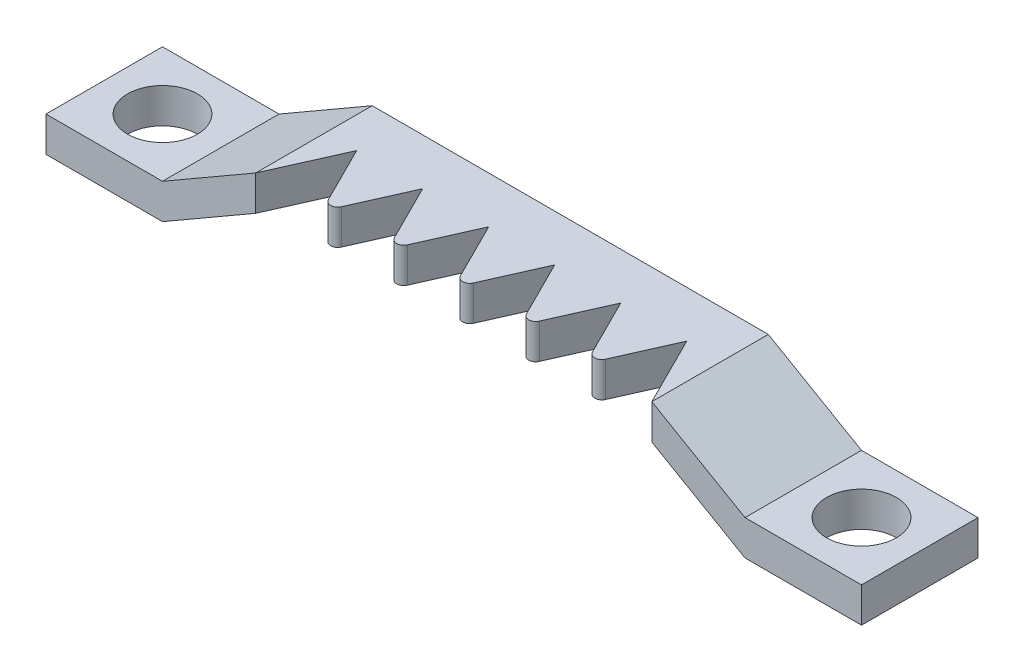
ISO-10303-21;
HEADER;
FILE_DESCRIPTION(('STEP AP214'),'2;1');
FILE_NAME('part.step','',(''),(''),'','','');
FILE_SCHEMA(('AUTOMOTIVE_DESIGN { 1 0 10303 214 1 1 1 1 }'));
ENDSEC;
DATA;
#1=APPLICATION_CONTEXT('core data for automotive mechanical design processes');
#2=APPLICATION_PROTOCOL_DEFINITION('international standard','automotive_design',2000,#1);
#3=PRODUCT_CONTEXT('',#1,'mechanical');
#4=PRODUCT('Part','Part','',(#3));
#5=PRODUCT_RELATED_PRODUCT_CATEGORY('part','',(#4));
#6=PRODUCT_DEFINITION_FORMATION('','',#4);
#7=PRODUCT_DEFINITION_CONTEXT('part definition',#1,'design');
#8=PRODUCT_DEFINITION('design','',#6,#7);
#9=PRODUCT_DEFINITION_SHAPE('','',#8);
#10=(LENGTH_UNIT() NAMED_UNIT(*) SI_UNIT(.MILLI.,.METRE.));
#11=(NAMED_UNIT(*) PLANE_ANGLE_UNIT() SI_UNIT($,.RADIAN.));
#12=(NAMED_UNIT(*) SI_UNIT($,.STERADIAN.) SOLID_ANGLE_UNIT());
#13=UNCERTAINTY_MEASURE_WITH_UNIT(LENGTH_MEASURE(1.E-05),#10,'distance_accuracy_value','');
#14=(GEOMETRIC_REPRESENTATION_CONTEXT(3) GLOBAL_UNCERTAINTY_ASSIGNED_CONTEXT((#13)) GLOBAL_UNIT_ASSIGNED_CONTEXT((#10,
#11,#12)) REPRESENTATION_CONTEXT('',''));
#15=CARTESIAN_POINT('',(0.,0.,0.));
#16=DIRECTION('',(0.,0.,1.));
#17=DIRECTION('',(1.,0.,0.));
#18=AXIS2_PLACEMENT_3D('',#15,#16,#17);
#19=CARTESIAN_POINT('',(0.,0.,6.35));
#20=DIRECTION('',(0.,0.,1.));
#21=DIRECTION('',(1.,0.,0.));
#22=AXIS2_PLACEMENT_3D('',#19,#20,#21);
#23=PLANE('',#22);
#24=DIRECTION('',(0.,1.,0.));
#25=VECTOR('',#24,1.);
#26=CARTESIAN_POINT('',(11.43,-0.00100000000000534,6.35));
#27=LINE('',#26,#25);
#28=CARTESIAN_POINT('',(11.43,2.93293936748331,6.35));
#29=VERTEX_POINT('',#28);
#30=CARTESIAN_POINT('',(11.43,4.83793936748331,6.35));
#31=VERTEX_POINT('',#30);
#32=EDGE_CURVE('E345',#29,#31,#27,.T.);
#33=ORIENTED_EDGE('',*,*,#32,.T.);
#34=DIRECTION('',(-0.866025403784438,-0.500000000000001,0.));
#35=VECTOR('',#34,1.);
#36=CARTESIAN_POINT('',(11.43,4.83793936748331,6.35));
#37=LINE('',#36,#35);
#38=CARTESIAN_POINT('',(6.35,1.905,6.35));
#39=VERTEX_POINT('',#38);
#40=EDGE_CURVE('E384',#31,#39,#37,.T.);
#41=ORIENTED_EDGE('',*,*,#40,.T.);
#42=DIRECTION('',(-1.,0.,0.));
#43=VECTOR('',#42,1.);
#44=CARTESIAN_POINT('',(6.35,1.905,6.35));
#45=LINE('',#44,#43);
#46=CARTESIAN_POINT('',(0.,1.905,6.35));
#47=VERTEX_POINT('',#46);
#48=EDGE_CURVE('E386',#39,#47,#45,.T.);
#49=ORIENTED_EDGE('',*,*,#48,.T.);
#50=DIRECTION('',(0.,-1.,0.));
#51=VECTOR('',#50,1.);
#52=CARTESIAN_POINT('',(0.,1.905,6.35));
#53=LINE('',#52,#51);
#54=CARTESIAN_POINT('',(0.,0.,6.35));
#55=VERTEX_POINT('',#54);
#56=EDGE_CURVE('E364',#47,#55,#53,.T.);
#57=ORIENTED_EDGE('',*,*,#56,.T.);
#58=DIRECTION('',(1.,0.,0.));
#59=VECTOR('',#58,1.);
#60=CARTESIAN_POINT('',(0.,0.,6.35));
#61=LINE('',#60,#59);
#62=CARTESIAN_POINT('',(6.35,0.,6.35));
#63=VERTEX_POINT('',#62);
#64=EDGE_CURVE('E367',#55,#63,#61,.T.);
#65=ORIENTED_EDGE('',*,*,#64,.T.);
#66=DIRECTION('',(0.866025403784438,0.500000000000001,0.));
#67=VECTOR('',#66,1.);
#68=CARTESIAN_POINT('',(6.35,0.,6.35));
#69=LINE('',#68,#67);
#70=EDGE_CURVE('E370',#63,#29,#69,.T.);
#71=ORIENTED_EDGE('',*,*,#70,.T.);
#72=EDGE_LOOP('',(#33,#41,#49,#57,#65,#71));
#73=FACE_BOUND('',#72,.T.);
#74=ADVANCED_FACE('F69',(#73),#23,.T.);
#75=CARTESIAN_POINT('',(0.,1.905,6.35));
#76=DIRECTION('',(1.,0.,0.));
#77=DIRECTION('',(0.,0.,-1.));
#78=AXIS2_PLACEMENT_3D('',#75,#76,#77);
#79=PLANE('',#78);
#80=DIRECTION('',(0.,-1.,0.));
#81=VECTOR('',#80,1.);
#82=CARTESIAN_POINT('',(0.,1.905,0.));
#83=LINE('',#82,#81);
#84=CARTESIAN_POINT('',(0.,1.905,0.));
#85=VERTEX_POINT('',#84);
#86=CARTESIAN_POINT('',(0.,0.,0.));
#87=VERTEX_POINT('',#86);
#88=EDGE_CURVE('E359',#85,#87,#83,.T.);
#89=ORIENTED_EDGE('',*,*,#88,.T.);
#90=DIRECTION('',(0.,0.,-1.));
#91=VECTOR('',#90,1.);
#92=CARTESIAN_POINT('',(0.,0.,6.35));
#93=LINE('',#92,#91);
#94=EDGE_CURVE('E444',#55,#87,#93,.T.);
#95=ORIENTED_EDGE('',*,*,#94,.F.);
#96=ORIENTED_EDGE('',*,*,#56,.F.);
#97=DIRECTION('',(0.,0.,-1.));
#98=VECTOR('',#97,1.);
#99=CARTESIAN_POINT('',(0.,1.905,6.35));
#100=LINE('',#99,#98);
#101=EDGE_CURVE('E388',#47,#85,#100,.T.);
#102=ORIENTED_EDGE('',*,*,#101,.T.);
#103=EDGE_LOOP('',(#89,#95,#96,#102));
#104=FACE_BOUND('',#103,.T.);
#105=ADVANCED_FACE('F535',(#104),#79,.F.);
#106=CARTESIAN_POINT('',(0.,0.,6.35));
#107=DIRECTION('',(0.,1.,0.));
#108=DIRECTION('',(-1.,0.,0.));
#109=AXIS2_PLACEMENT_3D('',#106,#107,#108);
#110=PLANE('',#109);
#111=CARTESIAN_POINT('',(3.175,0.,3.175));
#112=DIRECTION('',(0.,1.,0.));
#113=DIRECTION('',(-1.,0.,0.));
#114=AXIS2_PLACEMENT_3D('',#111,#112,#113);
#115=CIRCLE('',#114,1.905);
#116=CARTESIAN_POINT('',(1.27,0.,3.175));
#117=VERTEX_POINT('',#116);
#118=EDGE_CURVE('E356',#117,#117,#115,.F.);
#119=ORIENTED_EDGE('',*,*,#118,.F.);
#120=EDGE_LOOP('',(#119));
#121=FACE_BOUND('',#120,.T.);
#122=DIRECTION('',(1.,0.,0.));
#123=VECTOR('',#122,1.);
#124=CARTESIAN_POINT('',(0.,0.,0.));
#125=LINE('',#124,#123);
#126=CARTESIAN_POINT('',(6.35,0.,0.));
#127=VERTEX_POINT('',#126);
#128=EDGE_CURVE('E391',#87,#127,#125,.T.);
#129=ORIENTED_EDGE('',*,*,#128,.T.);
#130=DIRECTION('',(0.,0.,-1.));
#131=VECTOR('',#130,1.);
#132=CARTESIAN_POINT('',(6.35,0.,6.35));
#133=LINE('',#132,#131);
#134=EDGE_CURVE('E441',#63,#127,#133,.T.);
#135=ORIENTED_EDGE('',*,*,#134,.F.);
#136=ORIENTED_EDGE('',*,*,#64,.F.);
#137=ORIENTED_EDGE('',*,*,#94,.T.);
#138=EDGE_LOOP('',(#129,#135,#136,#137));
#139=FACE_BOUND('',#138,.T.);
#140=ADVANCED_FACE('F542',(#121,#139),#110,.F.);
#141=CARTESIAN_POINT('',(6.35,0.,6.35));
#142=DIRECTION('',(-0.500000000000001,0.866025403784438,0.));
#143=DIRECTION('',(-0.866025403784438,-0.500000000000001,0.));
#144=AXIS2_PLACEMENT_3D('',#141,#142,#143);
#145=PLANE('',#144);
#146=DIRECTION('',(0.866025403784438,0.500000000000001,0.));
#147=VECTOR('',#146,1.);
#148=CARTESIAN_POINT('',(6.35,0.,0.));
#149=LINE('',#148,#147);
#150=CARTESIAN_POINT('',(11.43,2.93293936748331,0.));
#151=VERTEX_POINT('',#150);
#152=EDGE_CURVE('E393',#127,#151,#149,.T.);
#153=ORIENTED_EDGE('',*,*,#152,.T.);
#154=DIRECTION('',(0.,0.,-1.));
#155=VECTOR('',#154,1.);
#156=CARTESIAN_POINT('',(11.43,2.93293936748331,6.35));
#157=LINE('',#156,#155);
#158=EDGE_CURVE('E438',#29,#151,#157,.T.);
#159=ORIENTED_EDGE('',*,*,#158,.F.);
#160=ORIENTED_EDGE('',*,*,#70,.F.);
#161=ORIENTED_EDGE('',*,*,#134,.T.);
#162=EDGE_LOOP('',(#153,#159,#160,#161));
#163=FACE_BOUND('',#162,.T.);
#164=ADVANCED_FACE('F617',(#163),#145,.F.);
#165=CARTESIAN_POINT('',(11.43,2.93293936748331,6.35));
#166=DIRECTION('',(0.,1.,0.));
#167=DIRECTION('',(0.,0.,1.));
#168=AXIS2_PLACEMENT_3D('',#165,#166,#167);
#169=PLANE('',#168);
#170=DIRECTION('',(0.406138466053445,0.,-0.913811548620258));
#171=VECTOR('',#170,1.);
#172=CARTESIAN_POINT('',(14.9061340206186,2.93293936748331,6.62494845360823));
#173=LINE('',#172,#171);
#174=CARTESIAN_POINT('',(15.3562221671944,2.93293936748331,5.61225012381264));
#175=VERTEX_POINT('',#174);
#176=CARTESIAN_POINT('',(16.7216666666667,2.93293936748331,2.5400000000001));
#177=VERTEX_POINT('',#176);
#178=EDGE_CURVE('E268',#175,#177,#173,.T.);
#179=ORIENTED_EDGE('',*,*,#178,.F.);
#180=CARTESIAN_POINT('',(15.0080599671701,2.93293936748331,5.45751136824628));
#181=DIRECTION('',(0.,1.,0.));
#182=DIRECTION('',(0.,0.,1.));
#183=AXIS2_PLACEMENT_3D('',#180,#181,#182);
#184=CIRCLE('',#183,0.381);
#185=CARTESIAN_POINT('',(14.6672832073991,2.93293936748331,5.62789974813177));
#186=VERTEX_POINT('',#185);
#187=EDGE_CURVE('E468',#175,#186,#184,.F.);
#188=ORIENTED_EDGE('',*,*,#187,.T.);
#189=DIRECTION('',(0.447213595499958,0.,0.894427190999916));
#190=VECTOR('',#189,1.);
#191=CARTESIAN_POINT('',(9.48266666666661,2.93293936748331,-4.7413333333333));
#192=LINE('',#191,#190);
#193=CARTESIAN_POINT('',(13.1233333333333,2.93293936748331,2.54000000000013));
#194=VERTEX_POINT('',#193);
#195=EDGE_CURVE('E330',#194,#186,#192,.T.);
#196=ORIENTED_EDGE('',*,*,#195,.F.);
#197=DIRECTION('',(0.406138466053447,0.,-0.913811548620258));
#198=VECTOR('',#197,1.);
#199=CARTESIAN_POINT('',(11.9013402061856,2.93293936748331,5.28948453608248));
#200=LINE('',#199,#198);
#201=EDGE_CURVE('E300',#29,#194,#200,.T.);
#202=ORIENTED_EDGE('',*,*,#201,.F.);
#203=ORIENTED_EDGE('',*,*,#158,.T.);
#204=DIRECTION('',(1.,0.,0.));
#205=VECTOR('',#204,1.);
#206=CARTESIAN_POINT('',(11.43,2.93293936748331,0.));
#207=LINE('',#206,#205);
#208=CARTESIAN_POINT('',(33.02,2.93293936748331,0.));
#209=VERTEX_POINT('',#208);
#210=EDGE_CURVE('E395',#151,#209,#207,.T.);
#211=ORIENTED_EDGE('',*,*,#210,.T.);
#212=DIRECTION('',(0.,0.,-1.));
#213=VECTOR('',#212,1.);
#214=CARTESIAN_POINT('',(33.02,2.93293936748331,6.35));
#215=LINE('',#214,#213);
#216=CARTESIAN_POINT('',(33.02,2.93293936748331,6.35));
#217=VERTEX_POINT('',#216);
#218=EDGE_CURVE('E435',#217,#209,#215,.T.);
#219=ORIENTED_EDGE('',*,*,#218,.F.);
#220=DIRECTION('',(0.447213595499958,0.,0.894427190999916));
#221=VECTOR('',#220,1.);
#222=CARTESIAN_POINT('',(23.876,2.93293936748331,-11.938));
#223=LINE('',#222,#221);
#224=CARTESIAN_POINT('',(31.115,2.93293936748331,2.54));
#225=VERTEX_POINT('',#224);
#226=EDGE_CURVE('E285',#225,#217,#223,.T.);
#227=ORIENTED_EDGE('',*,*,#226,.F.);
#228=DIRECTION('',(0.406138466053446,0.,-0.913811548620258));
#229=VECTOR('',#228,1.);
#230=CARTESIAN_POINT('',(26.9253092783505,2.93293936748331,11.9668041237113));
#231=LINE('',#230,#229);
#232=CARTESIAN_POINT('',(29.7495555005278,2.93293936748331,5.61225012381253));
#233=VERTEX_POINT('',#232);
#234=EDGE_CURVE('E297',#233,#225,#231,.T.);
#235=ORIENTED_EDGE('',*,*,#234,.F.);
#236=CARTESIAN_POINT('',(29.4013933005034,2.93293936748331,5.45751136824617));
#237=DIRECTION('',(0.,1.,0.));
#238=DIRECTION('',(0.,0.,1.));
#239=AXIS2_PLACEMENT_3D('',#236,#237,#238);
#240=CIRCLE('',#239,0.381);
#241=CARTESIAN_POINT('',(29.0606165407325,2.93293936748331,5.62789974813166));
#242=VERTEX_POINT('',#241);
#243=EDGE_CURVE('E461',#233,#242,#240,.F.);
#244=ORIENTED_EDGE('',*,*,#243,.T.);
#245=DIRECTION('',(0.447213595499959,0.,0.894427190999916));
#246=VECTOR('',#245,1.);
#247=CARTESIAN_POINT('',(20.9973333333333,2.93293936748331,-10.4986666666667));
#248=LINE('',#247,#246);
#249=CARTESIAN_POINT('',(27.5166666666667,2.93293936748331,2.54000000000002));
#250=VERTEX_POINT('',#249);
#251=EDGE_CURVE('E323',#250,#242,#248,.T.);
#252=ORIENTED_EDGE('',*,*,#251,.F.);
#253=DIRECTION('',(0.406138466053446,0.,-0.913811548620258));
#254=VECTOR('',#253,1.);
#255=CARTESIAN_POINT('',(23.9205154639176,2.93293936748331,10.6313402061855));
#256=LINE('',#255,#254);
#257=CARTESIAN_POINT('',(26.1512221671944,2.93293936748331,5.61225012381256));
#258=VERTEX_POINT('',#257);
#259=EDGE_CURVE('E312',#258,#250,#256,.T.);
#260=ORIENTED_EDGE('',*,*,#259,.F.);
#261=CARTESIAN_POINT('',(25.8030599671701,2.93293936748331,5.4575113682462));
#262=DIRECTION('',(0.,1.,0.));
#263=DIRECTION('',(0.,0.,1.));
#264=AXIS2_PLACEMENT_3D('',#261,#262,#263);
#265=CIRCLE('',#264,0.381);
#266=CARTESIAN_POINT('',(25.4622832073991,2.93293936748331,5.62789974813169));
#267=VERTEX_POINT('',#266);
#268=EDGE_CURVE('E463',#258,#267,#265,.F.);
#269=ORIENTED_EDGE('',*,*,#268,.T.);
#270=DIRECTION('',(0.447213595499958,0.,0.894427190999916));
#271=VECTOR('',#270,1.);
#272=CARTESIAN_POINT('',(18.1186666666666,2.93293936748331,-9.05933333333332));
#273=LINE('',#272,#271);
#274=CARTESIAN_POINT('',(23.9183333333333,2.93293936748331,2.54000000000005));
#275=VERTEX_POINT('',#274);
#276=EDGE_CURVE('E288',#275,#267,#273,.T.);
#277=ORIENTED_EDGE('',*,*,#276,.F.);
#278=DIRECTION('',(0.406138466053446,0.,-0.913811548620258));
#279=VECTOR('',#278,1.);
#280=CARTESIAN_POINT('',(20.9157216494846,2.93293936748331,9.29587628865975));
#281=LINE('',#280,#279);
#282=CARTESIAN_POINT('',(22.5528888338611,2.93293936748331,5.61225012381258));
#283=VERTEX_POINT('',#282);
#284=EDGE_CURVE('E284',#283,#275,#281,.T.);
#285=ORIENTED_EDGE('',*,*,#284,.F.);
#286=CARTESIAN_POINT('',(22.2047266338368,2.93293936748331,5.45751136824622));
#287=DIRECTION('',(0.,1.,0.));
#288=DIRECTION('',(0.,0.,1.));
#289=AXIS2_PLACEMENT_3D('',#286,#287,#288);
#290=CIRCLE('',#289,0.381);
#291=CARTESIAN_POINT('',(21.8639498740658,2.93293936748331,5.6278997481317));
#292=VERTEX_POINT('',#291);
#293=EDGE_CURVE('E92',#283,#292,#290,.F.);
#294=ORIENTED_EDGE('',*,*,#293,.T.);
#295=DIRECTION('',(0.447213595499958,0.,0.894427190999916));
#296=VECTOR('',#295,1.);
#297=CARTESIAN_POINT('',(15.24,2.93293936748331,-7.61999999999998));
#298=LINE('',#297,#296);
#299=CARTESIAN_POINT('',(20.32,2.93293936748331,2.54000000000008));
#300=VERTEX_POINT('',#299);
#301=EDGE_CURVE('E315',#300,#292,#298,.T.);
#302=ORIENTED_EDGE('',*,*,#301,.F.);
#303=DIRECTION('',(0.406138466053446,0.,-0.913811548620258));
#304=VECTOR('',#303,1.);
#305=CARTESIAN_POINT('',(17.9109278350516,2.93293936748331,7.96041237113399));
#306=LINE('',#305,#304);
#307=CARTESIAN_POINT('',(18.9545555005278,2.93293936748331,5.61225012381261));
#308=VERTEX_POINT('',#307);
#309=EDGE_CURVE('E327',#308,#300,#306,.T.);
#310=ORIENTED_EDGE('',*,*,#309,.F.);
#311=CARTESIAN_POINT('',(18.6063933005034,2.93293936748331,5.45751136824625));
#312=DIRECTION('',(0.,1.,0.));
#313=DIRECTION('',(0.,0.,1.));
#314=AXIS2_PLACEMENT_3D('',#311,#312,#313);
#315=CIRCLE('',#314,0.381);
#316=CARTESIAN_POINT('',(18.2656165407325,2.93293936748331,5.62789974813174));
#317=VERTEX_POINT('',#316);
#318=EDGE_CURVE('E466',#308,#317,#315,.F.);
#319=ORIENTED_EDGE('',*,*,#318,.T.);
#320=DIRECTION('',(0.447213595499958,0.,0.894427190999916));
#321=VECTOR('',#320,1.);
#322=CARTESIAN_POINT('',(12.3613333333333,2.93293936748331,-6.18066666666664));
#323=LINE('',#322,#321);
#324=EDGE_CURVE('E275',#177,#317,#323,.T.);
#325=ORIENTED_EDGE('',*,*,#324,.F.);
#326=EDGE_LOOP('',(#179,#188,#196,#202,#203,#211,#219,#227,#235,#244,#252,#260,#269,#277,#285,
#294,#302,#310,#319,#325));
#327=FACE_BOUND('',#326,.T.);
#328=ADVANCED_FACE('F502',(#327),#169,.F.);
#329=CARTESIAN_POINT('',(33.02,2.93293936748331,6.35));
#330=DIRECTION('',(0.500000000000001,0.866025403784438,0.));
#331=DIRECTION('',(-0.866025403784438,0.500000000000001,0.));
#332=AXIS2_PLACEMENT_3D('',#329,#330,#331);
#333=PLANE('',#332);
#334=DIRECTION('',(0.866025403784438,-0.500000000000001,0.));
#335=VECTOR('',#334,1.);
#336=CARTESIAN_POINT('',(33.02,2.93293936748331,0.));
#337=LINE('',#336,#335);
#338=CARTESIAN_POINT('',(38.1,0.,0.));
#339=VERTEX_POINT('',#338);
#340=EDGE_CURVE('E397',#209,#339,#337,.T.);
#341=ORIENTED_EDGE('',*,*,#340,.T.);
#342=DIRECTION('',(0.,0.,-1.));
#343=VECTOR('',#342,1.);
#344=CARTESIAN_POINT('',(38.1,0.,6.35));
#345=LINE('',#344,#343);
#346=CARTESIAN_POINT('',(38.1,0.,6.35));
#347=VERTEX_POINT('',#346);
#348=EDGE_CURVE('E432',#347,#339,#345,.T.);
#349=ORIENTED_EDGE('',*,*,#348,.F.);
#350=DIRECTION('',(0.866025403784438,-0.500000000000001,0.));
#351=VECTOR('',#350,1.);
#352=CARTESIAN_POINT('',(33.02,2.93293936748331,6.35));
#353=LINE('',#352,#351);
#354=EDGE_CURVE('E373',#217,#347,#353,.T.);
#355=ORIENTED_EDGE('',*,*,#354,.F.);
#356=ORIENTED_EDGE('',*,*,#218,.T.);
#357=EDGE_LOOP('',(#341,#349,#355,#356));
#358=FACE_BOUND('',#357,.T.);
#359=ADVANCED_FACE('F573',(#358),#333,.F.);
#360=CARTESIAN_POINT('',(38.1,0.,6.35));
#361=DIRECTION('',(0.,1.,0.));
#362=DIRECTION('',(0.,0.,1.));
#363=AXIS2_PLACEMENT_3D('',#360,#361,#362);
#364=PLANE('',#363);
#365=CARTESIAN_POINT('',(41.275,0.,3.175));
#366=DIRECTION('',(0.,1.,0.));
#367=DIRECTION('',(0.,0.,1.));
#368=AXIS2_PLACEMENT_3D('',#365,#366,#367);
#369=CIRCLE('',#368,1.905);
#370=CARTESIAN_POINT('',(41.275,0.,5.08));
#371=VERTEX_POINT('',#370);
#372=EDGE_CURVE('E355',#371,#371,#369,.F.);
#373=ORIENTED_EDGE('',*,*,#372,.F.);
#374=EDGE_LOOP('',(#373));
#375=FACE_BOUND('',#374,.T.);
#376=DIRECTION('',(1.,0.,0.));
#377=VECTOR('',#376,1.);
#378=CARTESIAN_POINT('',(38.1,0.,0.));
#379=LINE('',#378,#377);
#380=CARTESIAN_POINT('',(44.45,0.,0.));
#381=VERTEX_POINT('',#380);
#382=EDGE_CURVE('E399',#339,#381,#379,.T.);
#383=ORIENTED_EDGE('',*,*,#382,.T.);
#384=DIRECTION('',(0.,0.,-1.));
#385=VECTOR('',#384,1.);
#386=CARTESIAN_POINT('',(44.45,0.,6.35));
#387=LINE('',#386,#385);
#388=CARTESIAN_POINT('',(44.45,0.,6.35));
#389=VERTEX_POINT('',#388);
#390=EDGE_CURVE('E429',#389,#381,#387,.T.);
#391=ORIENTED_EDGE('',*,*,#390,.F.);
#392=DIRECTION('',(1.,0.,0.));
#393=VECTOR('',#392,1.);
#394=CARTESIAN_POINT('',(38.1,0.,6.35));
#395=LINE('',#394,#393);
#396=EDGE_CURVE('E375',#347,#389,#395,.T.);
#397=ORIENTED_EDGE('',*,*,#396,.F.);
#398=ORIENTED_EDGE('',*,*,#348,.T.);
#399=EDGE_LOOP('',(#383,#391,#397,#398));
#400=FACE_BOUND('',#399,.T.);
#401=ADVANCED_FACE('F578',(#375,#400),#364,.F.);
#402=CARTESIAN_POINT('',(44.45,0.,6.35));
#403=DIRECTION('',(-1.,0.,0.));
#404=DIRECTION('',(0.,0.,1.));
#405=AXIS2_PLACEMENT_3D('',#402,#403,#404);
#406=PLANE('',#405);
#407=DIRECTION('',(0.,1.,0.));
#408=VECTOR('',#407,1.);
#409=CARTESIAN_POINT('',(44.45,0.,0.));
#410=LINE('',#409,#408);
#411=CARTESIAN_POINT('',(44.45,1.905,0.));
#412=VERTEX_POINT('',#411);
#413=EDGE_CURVE('E401',#381,#412,#410,.T.);
#414=ORIENTED_EDGE('',*,*,#413,.T.);
#415=DIRECTION('',(0.,0.,-1.));
#416=VECTOR('',#415,1.);
#417=CARTESIAN_POINT('',(44.45,1.905,6.35));
#418=LINE('',#417,#416);
#419=CARTESIAN_POINT('',(44.45,1.905,6.35));
#420=VERTEX_POINT('',#419);
#421=EDGE_CURVE('E426',#420,#412,#418,.T.);
#422=ORIENTED_EDGE('',*,*,#421,.F.);
#423=DIRECTION('',(0.,1.,0.));
#424=VECTOR('',#423,1.);
#425=CARTESIAN_POINT('',(44.45,0.,6.35));
#426=LINE('',#425,#424);
#427=EDGE_CURVE('E377',#389,#420,#426,.T.);
#428=ORIENTED_EDGE('',*,*,#427,.F.);
#429=ORIENTED_EDGE('',*,*,#390,.T.);
#430=EDGE_LOOP('',(#414,#422,#428,#429));
#431=FACE_BOUND('',#430,.T.);
#432=ADVANCED_FACE('F584',(#431),#406,.F.);
#433=CARTESIAN_POINT('',(44.45,1.905,6.35));
#434=DIRECTION('',(0.,-1.,0.));
#435=DIRECTION('',(1.,0.,0.));
#436=AXIS2_PLACEMENT_3D('',#433,#434,#435);
#437=PLANE('',#436);
#438=CARTESIAN_POINT('',(41.275,1.905,3.175));
#439=DIRECTION('',(0.,-1.,0.));
#440=DIRECTION('',(1.,0.,0.));
#441=AXIS2_PLACEMENT_3D('',#438,#439,#440);
#442=CIRCLE('',#441,1.905);
#443=CARTESIAN_POINT('',(43.18,1.905,3.175));
#444=VERTEX_POINT('',#443);
#445=EDGE_CURVE('E352',#444,#444,#442,.F.);
#446=ORIENTED_EDGE('',*,*,#445,.F.);
#447=EDGE_LOOP('',(#446));
#448=FACE_BOUND('',#447,.T.);
#449=DIRECTION('',(-1.,0.,0.));
#450=VECTOR('',#449,1.);
#451=CARTESIAN_POINT('',(44.45,1.905,0.));
#452=LINE('',#451,#450);
#453=CARTESIAN_POINT('',(38.1,1.905,0.));
#454=VERTEX_POINT('',#453);
#455=EDGE_CURVE('E403',#412,#454,#452,.T.);
#456=ORIENTED_EDGE('',*,*,#455,.T.);
#457=DIRECTION('',(0.,0.,-1.));
#458=VECTOR('',#457,1.);
#459=CARTESIAN_POINT('',(38.1,1.905,6.35));
#460=LINE('',#459,#458);
#461=CARTESIAN_POINT('',(38.1,1.905,6.35));
#462=VERTEX_POINT('',#461);
#463=EDGE_CURVE('E423',#462,#454,#460,.T.);
#464=ORIENTED_EDGE('',*,*,#463,.F.);
#465=DIRECTION('',(-1.,0.,0.));
#466=VECTOR('',#465,1.);
#467=CARTESIAN_POINT('',(44.45,1.905,6.35));
#468=LINE('',#467,#466);
#469=EDGE_CURVE('E379',#420,#462,#468,.T.);
#470=ORIENTED_EDGE('',*,*,#469,.F.);
#471=ORIENTED_EDGE('',*,*,#421,.T.);
#472=EDGE_LOOP('',(#456,#464,#470,#471));
#473=FACE_BOUND('',#472,.T.);
#474=ADVANCED_FACE('F588',(#448,#473),#437,.F.);
#475=CARTESIAN_POINT('',(38.1,1.905,6.35));
#476=DIRECTION('',(-0.500000000000001,-0.866025403784438,0.));
#477=DIRECTION('',(0.866025403784438,-0.500000000000001,0.));
#478=AXIS2_PLACEMENT_3D('',#475,#476,#477);
#479=PLANE('',#478);
#480=DIRECTION('',(-0.866025403784438,0.500000000000001,0.));
#481=VECTOR('',#480,1.);
#482=CARTESIAN_POINT('',(38.1,1.905,0.));
#483=LINE('',#482,#481);
#484=CARTESIAN_POINT('',(33.02,4.83793936748331,0.));
#485=VERTEX_POINT('',#484);
#486=EDGE_CURVE('E405',#454,#485,#483,.T.);
#487=ORIENTED_EDGE('',*,*,#486,.T.);
#488=DIRECTION('',(0.,0.,-1.));
#489=VECTOR('',#488,1.);
#490=CARTESIAN_POINT('',(33.02,4.83793936748331,6.35));
#491=LINE('',#490,#489);
#492=CARTESIAN_POINT('',(33.02,4.83793936748331,6.35));
#493=VERTEX_POINT('',#492);
#494=EDGE_CURVE('E420',#493,#485,#491,.T.);
#495=ORIENTED_EDGE('',*,*,#494,.F.);
#496=DIRECTION('',(-0.866025403784438,0.500000000000001,0.));
#497=VECTOR('',#496,1.);
#498=CARTESIAN_POINT('',(38.1,1.905,6.35));
#499=LINE('',#498,#497);
#500=EDGE_CURVE('E381',#462,#493,#499,.T.);
#501=ORIENTED_EDGE('',*,*,#500,.F.);
#502=ORIENTED_EDGE('',*,*,#463,.T.);
#503=EDGE_LOOP('',(#487,#495,#501,#502));
#504=FACE_BOUND('',#503,.T.);
#505=ADVANCED_FACE('F591',(#504),#479,.F.);
#506=CARTESIAN_POINT('',(33.02,4.83793936748331,6.35));
#507=DIRECTION('',(0.,-1.,0.));
#508=DIRECTION('',(1.,0.,0.));
#509=AXIS2_PLACEMENT_3D('',#506,#507,#508);
#510=PLANE('',#509);
#511=DIRECTION('',(-0.447213595499958,0.,-0.894427190999916));
#512=VECTOR('',#511,1.);
#513=CARTESIAN_POINT('',(9.48266666666661,4.83793936748331,-4.7413333333333));
#514=LINE('',#513,#512);
#515=CARTESIAN_POINT('',(14.6672832073991,4.83793936748331,5.62789974813176));
#516=VERTEX_POINT('',#515);
#517=CARTESIAN_POINT('',(13.1233333333333,4.83793936748331,2.54000000000013));
#518=VERTEX_POINT('',#517);
#519=EDGE_CURVE('E340',#516,#518,#514,.T.);
#520=ORIENTED_EDGE('',*,*,#519,.F.);
#521=CARTESIAN_POINT('',(15.0080599671701,4.83793936748331,5.45751136824628));
#522=DIRECTION('',(0.,-1.,0.));
#523=DIRECTION('',(1.,0.,0.));
#524=AXIS2_PLACEMENT_3D('',#521,#522,#523);
#525=CIRCLE('',#524,0.381);
#526=CARTESIAN_POINT('',(15.3562221671944,4.83793936748331,5.61225012381264));
#527=VERTEX_POINT('',#526);
#528=EDGE_CURVE('E279',#516,#527,#525,.F.);
#529=ORIENTED_EDGE('',*,*,#528,.T.);
#530=DIRECTION('',(-0.406138466053445,0.,0.913811548620258));
#531=VECTOR('',#530,1.);
#532=CARTESIAN_POINT('',(14.9061340206186,4.83793936748331,6.62494845360823));
#533=LINE('',#532,#531);
#534=CARTESIAN_POINT('',(16.7216666666667,4.83793936748331,2.5400000000001));
#535=VERTEX_POINT('',#534);
#536=EDGE_CURVE('E267',#535,#527,#533,.T.);
#537=ORIENTED_EDGE('',*,*,#536,.F.);
#538=DIRECTION('',(-0.447213595499958,0.,-0.894427190999916));
#539=VECTOR('',#538,1.);
#540=CARTESIAN_POINT('',(12.3613333333333,4.83793936748331,-6.18066666666664));
#541=LINE('',#540,#539);
#542=CARTESIAN_POINT('',(18.2656165407325,4.83793936748331,5.62789974813174));
#543=VERTEX_POINT('',#542);
#544=EDGE_CURVE('E257',#543,#535,#541,.T.);
#545=ORIENTED_EDGE('',*,*,#544,.F.);
#546=CARTESIAN_POINT('',(18.6063933005034,4.83793936748331,5.45751136824625));
#547=DIRECTION('',(0.,-1.,0.));
#548=DIRECTION('',(1.,0.,0.));
#549=AXIS2_PLACEMENT_3D('',#546,#547,#548);
#550=CIRCLE('',#549,0.381);
#551=CARTESIAN_POINT('',(18.9545555005278,4.83793936748331,5.61225012381261));
#552=VERTEX_POINT('',#551);
#553=EDGE_CURVE('E456',#543,#552,#550,.F.);
#554=ORIENTED_EDGE('',*,*,#553,.T.);
#555=DIRECTION('',(-0.406138466053445,0.,0.913811548620258));
#556=VECTOR('',#555,1.);
#557=CARTESIAN_POINT('',(17.9109278350516,4.83793936748331,7.96041237113399));
#558=LINE('',#557,#556);
#559=CARTESIAN_POINT('',(20.32,4.83793936748331,2.54000000000008));
#560=VERTEX_POINT('',#559);
#561=EDGE_CURVE('E332',#560,#552,#558,.T.);
#562=ORIENTED_EDGE('',*,*,#561,.F.);
#563=DIRECTION('',(-0.447213595499958,0.,-0.894427190999916));
#564=VECTOR('',#563,1.);
#565=CARTESIAN_POINT('',(15.24,4.83793936748331,-7.61999999999998));
#566=LINE('',#565,#564);
#567=CARTESIAN_POINT('',(21.8639498740658,4.83793936748331,5.6278997481317));
#568=VERTEX_POINT('',#567);
#569=EDGE_CURVE('E329',#568,#560,#566,.T.);
#570=ORIENTED_EDGE('',*,*,#569,.F.);
#571=CARTESIAN_POINT('',(22.2047266338368,4.83793936748331,5.45751136824622));
#572=DIRECTION('',(0.,-1.,0.));
#573=DIRECTION('',(1.,0.,0.));
#574=AXIS2_PLACEMENT_3D('',#571,#572,#573);
#575=CIRCLE('',#574,0.381);
#576=CARTESIAN_POINT('',(22.5528888338611,4.83793936748331,5.61225012381259));
#577=VERTEX_POINT('',#576);
#578=EDGE_CURVE('E454',#568,#577,#575,.F.);
#579=ORIENTED_EDGE('',*,*,#578,.T.);
#580=DIRECTION('',(-0.406138466053445,0.,0.913811548620258));
#581=VECTOR('',#580,1.);
#582=CARTESIAN_POINT('',(20.9157216494846,4.83793936748331,9.29587628865975));
#583=LINE('',#582,#581);
#584=CARTESIAN_POINT('',(23.9183333333333,4.83793936748331,2.54000000000005));
#585=VERTEX_POINT('',#584);
#586=EDGE_CURVE('E304',#585,#577,#583,.T.);
#587=ORIENTED_EDGE('',*,*,#586,.F.);
#588=DIRECTION('',(-0.447213595499958,0.,-0.894427190999916));
#589=VECTOR('',#588,1.);
#590=CARTESIAN_POINT('',(18.1186666666666,4.83793936748331,-9.05933333333332));
#591=LINE('',#590,#589);
#592=CARTESIAN_POINT('',(25.4622832073991,4.83793936748331,5.62789974813169));
#593=VERTEX_POINT('',#592);
#594=EDGE_CURVE('E302',#593,#585,#591,.T.);
#595=ORIENTED_EDGE('',*,*,#594,.F.);
#596=CARTESIAN_POINT('',(25.8030599671701,4.83793936748331,5.4575113682462));
#597=DIRECTION('',(0.,-1.,0.));
#598=DIRECTION('',(1.,0.,0.));
#599=AXIS2_PLACEMENT_3D('',#596,#597,#598);
#600=CIRCLE('',#599,0.381);
#601=CARTESIAN_POINT('',(26.1512221671944,4.83793936748331,5.61225012381256));
#602=VERTEX_POINT('',#601);
#603=EDGE_CURVE('E452',#593,#602,#600,.F.);
#604=ORIENTED_EDGE('',*,*,#603,.T.);
#605=DIRECTION('',(-0.406138466053446,0.,0.913811548620258));
#606=VECTOR('',#605,1.);
#607=CARTESIAN_POINT('',(23.9205154639176,4.83793936748331,10.6313402061855));
#608=LINE('',#607,#606);
#609=CARTESIAN_POINT('',(27.5166666666667,4.83793936748331,2.54000000000002));
#610=VERTEX_POINT('',#609);
#611=EDGE_CURVE('E317',#610,#602,#608,.T.);
#612=ORIENTED_EDGE('',*,*,#611,.F.);
#613=DIRECTION('',(-0.447213595499959,0.,-0.894427190999916));
#614=VECTOR('',#613,1.);
#615=CARTESIAN_POINT('',(20.9973333333333,4.83793936748331,-10.4986666666667));
#616=LINE('',#615,#614);
#617=CARTESIAN_POINT('',(29.0606165407325,4.83793936748331,5.62789974813165));
#618=VERTEX_POINT('',#617);
#619=EDGE_CURVE('E314',#618,#610,#616,.T.);
#620=ORIENTED_EDGE('',*,*,#619,.F.);
#621=CARTESIAN_POINT('',(29.4013933005034,4.83793936748331,5.45751136824617));
#622=DIRECTION('',(0.,-1.,0.));
#623=DIRECTION('',(1.,0.,0.));
#624=AXIS2_PLACEMENT_3D('',#621,#622,#623);
#625=CIRCLE('',#624,0.381);
#626=CARTESIAN_POINT('',(29.7495555005278,4.83793936748331,5.61225012381253));
#627=VERTEX_POINT('',#626);
#628=EDGE_CURVE('E450',#618,#627,#625,.F.);
#629=ORIENTED_EDGE('',*,*,#628,.T.);
#630=DIRECTION('',(-0.406138466053446,0.,0.913811548620258));
#631=VECTOR('',#630,1.);
#632=CARTESIAN_POINT('',(26.9253092783505,4.83793936748331,11.9668041237113));
#633=LINE('',#632,#631);
#634=CARTESIAN_POINT('',(31.115,4.83793936748331,2.54));
#635=VERTEX_POINT('',#634);
#636=EDGE_CURVE('E291',#635,#627,#633,.T.);
#637=ORIENTED_EDGE('',*,*,#636,.F.);
#638=DIRECTION('',(-0.447213595499958,0.,-0.894427190999916));
#639=VECTOR('',#638,1.);
#640=CARTESIAN_POINT('',(23.876,4.83793936748331,-11.938));
#641=LINE('',#640,#639);
#642=EDGE_CURVE('E287',#493,#635,#641,.T.);
#643=ORIENTED_EDGE('',*,*,#642,.F.);
#644=ORIENTED_EDGE('',*,*,#494,.T.);
#645=DIRECTION('',(-1.,0.,0.));
#646=VECTOR('',#645,1.);
#647=CARTESIAN_POINT('',(33.02,4.83793936748331,0.));
#648=LINE('',#647,#646);
#649=CARTESIAN_POINT('',(11.43,4.83793936748331,0.));
#650=VERTEX_POINT('',#649);
#651=EDGE_CURVE('E407',#485,#650,#648,.T.);
#652=ORIENTED_EDGE('',*,*,#651,.T.);
#653=DIRECTION('',(0.,0.,-1.));
#654=VECTOR('',#653,1.);
#655=CARTESIAN_POINT('',(11.43,4.83793936748331,6.35));
#656=LINE('',#655,#654);
#657=EDGE_CURVE('E417',#31,#650,#656,.T.);
#658=ORIENTED_EDGE('',*,*,#657,.F.);
#659=DIRECTION('',(-0.406138466053446,0.,0.913811548620258));
#660=VECTOR('',#659,1.);
#661=CARTESIAN_POINT('',(11.9013402061856,4.83793936748331,5.28948453608248));
#662=LINE('',#661,#660);
#663=EDGE_CURVE('E342',#518,#31,#662,.T.);
#664=ORIENTED_EDGE('',*,*,#663,.F.);
#665=EDGE_LOOP('',(#520,#529,#537,#545,#554,#562,#570,#579,#587,#595,#604,#612,#620,#629,#637,
#643,#644,#652,#658,#664));
#666=FACE_BOUND('',#665,.T.);
#667=ADVANCED_FACE('F278',(#666),#510,.F.);
#668=CARTESIAN_POINT('',(11.43,4.83793936748331,6.35));
#669=DIRECTION('',(0.500000000000001,-0.866025403784438,0.));
#670=DIRECTION('',(0.866025403784438,0.500000000000001,0.));
#671=AXIS2_PLACEMENT_3D('',#668,#669,#670);
#672=PLANE('',#671);
#673=DIRECTION('',(-0.866025403784438,-0.500000000000001,0.));
#674=VECTOR('',#673,1.);
#675=CARTESIAN_POINT('',(11.43,4.83793936748331,0.));
#676=LINE('',#675,#674);
#677=CARTESIAN_POINT('',(6.35,1.905,0.));
#678=VERTEX_POINT('',#677);
#679=EDGE_CURVE('E409',#650,#678,#676,.T.);
#680=ORIENTED_EDGE('',*,*,#679,.T.);
#681=DIRECTION('',(0.,0.,-1.));
#682=VECTOR('',#681,1.);
#683=CARTESIAN_POINT('',(6.35,1.905,6.35));
#684=LINE('',#683,#682);
#685=EDGE_CURVE('E414',#39,#678,#684,.T.);
#686=ORIENTED_EDGE('',*,*,#685,.F.);
#687=ORIENTED_EDGE('',*,*,#40,.F.);
#688=ORIENTED_EDGE('',*,*,#657,.T.);
#689=EDGE_LOOP('',(#680,#686,#687,#688));
#690=FACE_BOUND('',#689,.T.);
#691=ADVANCED_FACE('F557',(#690),#672,.F.);
#692=CARTESIAN_POINT('',(6.35,1.905,6.35));
#693=DIRECTION('',(0.,-1.,0.));
#694=DIRECTION('',(1.,0.,0.));
#695=AXIS2_PLACEMENT_3D('',#692,#693,#694);
#696=PLANE('',#695);
#697=CARTESIAN_POINT('',(3.175,1.905,3.175));
#698=DIRECTION('',(0.,-1.,0.));
#699=DIRECTION('',(1.,0.,0.));
#700=AXIS2_PLACEMENT_3D('',#697,#698,#699);
#701=CIRCLE('',#700,1.905);
#702=CARTESIAN_POINT('',(5.08,1.905,3.175));
#703=VERTEX_POINT('',#702);
#704=EDGE_CURVE('E326',#703,#703,#701,.F.);
#705=ORIENTED_EDGE('',*,*,#704,.F.);
#706=EDGE_LOOP('',(#705));
#707=FACE_BOUND('',#706,.T.);
#708=DIRECTION('',(-1.,0.,0.));
#709=VECTOR('',#708,1.);
#710=CARTESIAN_POINT('',(6.35,1.905,0.));
#711=LINE('',#710,#709);
#712=EDGE_CURVE('E368',#678,#85,#711,.T.);
#713=ORIENTED_EDGE('',*,*,#712,.T.);
#714=ORIENTED_EDGE('',*,*,#101,.F.);
#715=ORIENTED_EDGE('',*,*,#48,.F.);
#716=ORIENTED_EDGE('',*,*,#685,.T.);
#717=EDGE_LOOP('',(#713,#714,#715,#716));
#718=FACE_BOUND('',#717,.T.);
#719=ADVANCED_FACE('F549',(#707,#718),#696,.F.);
#720=DIRECTION('',(0.,1.,0.));
#721=VECTOR('',#720,1.);
#722=CARTESIAN_POINT('',(33.02,-0.00100000000000187,6.35));
#723=LINE('',#722,#721);
#724=EDGE_CURVE('E295',#217,#493,#723,.T.);
#725=ORIENTED_EDGE('',*,*,#724,.F.);
#726=ORIENTED_EDGE('',*,*,#354,.T.);
#727=ORIENTED_EDGE('',*,*,#396,.T.);
#728=ORIENTED_EDGE('',*,*,#427,.T.);
#729=ORIENTED_EDGE('',*,*,#469,.T.);
#730=ORIENTED_EDGE('',*,*,#500,.T.);
#731=EDGE_LOOP('',(#725,#726,#727,#728,#729,#730));
#732=FACE_BOUND('',#731,.T.);
#733=ADVANCED_FACE('F538',(#732),#23,.T.);
#734=CARTESIAN_POINT('',(0.,0.,0.));
#735=DIRECTION('',(0.,0.,1.));
#736=DIRECTION('',(1.,0.,0.));
#737=AXIS2_PLACEMENT_3D('',#734,#735,#736);
#738=PLANE('',#737);
#739=ORIENTED_EDGE('',*,*,#88,.F.);
#740=ORIENTED_EDGE('',*,*,#712,.F.);
#741=ORIENTED_EDGE('',*,*,#679,.F.);
#742=ORIENTED_EDGE('',*,*,#651,.F.);
#743=ORIENTED_EDGE('',*,*,#486,.F.);
#744=ORIENTED_EDGE('',*,*,#455,.F.);
#745=ORIENTED_EDGE('',*,*,#413,.F.);
#746=ORIENTED_EDGE('',*,*,#382,.F.);
#747=ORIENTED_EDGE('',*,*,#340,.F.);
#748=ORIENTED_EDGE('',*,*,#210,.F.);
#749=ORIENTED_EDGE('',*,*,#152,.F.);
#750=ORIENTED_EDGE('',*,*,#128,.F.);
#751=EDGE_LOOP('',(#739,#740,#741,#742,#743,#744,#745,#746,#747,#748,#749,#750));
#752=FACE_BOUND('',#751,.T.);
#753=ADVANCED_FACE('F548',(#752),#738,.F.);
#754=CARTESIAN_POINT('',(3.175,-0.00100000000000707,3.175));
#755=DIRECTION('',(0.,1.,0.));
#756=DIRECTION('',(-1.,0.,0.));
#757=AXIS2_PLACEMENT_3D('',#754,#755,#756);
#758=CYLINDRICAL_SURFACE('',#757,1.905);
#759=ORIENTED_EDGE('',*,*,#704,.T.);
#760=EDGE_LOOP('',(#759));
#761=FACE_BOUND('',#760,.T.);
#762=ORIENTED_EDGE('',*,*,#118,.T.);
#763=EDGE_LOOP('',(#762));
#764=FACE_BOUND('',#763,.T.);
#765=ADVANCED_FACE('F555',(#761,#764),#758,.F.);
#766=CARTESIAN_POINT('',(41.275,-0.001000000000001,3.175));
#767=DIRECTION('',(0.,1.,0.));
#768=DIRECTION('',(-1.,0.,0.));
#769=AXIS2_PLACEMENT_3D('',#766,#767,#768);
#770=CYLINDRICAL_SURFACE('',#769,1.905);
#771=ORIENTED_EDGE('',*,*,#445,.T.);
#772=EDGE_LOOP('',(#771));
#773=FACE_BOUND('',#772,.T.);
#774=ORIENTED_EDGE('',*,*,#372,.T.);
#775=EDGE_LOOP('',(#774));
#776=FACE_BOUND('',#775,.T.);
#777=ADVANCED_FACE('F779',(#773,#776),#770,.F.);
#778=CARTESIAN_POINT('',(11.9013402061856,-0.00100000000000534,5.28948453608248));
#779=DIRECTION('',(-0.913811548620258,0.,-0.406138466053446));
#780=DIRECTION('',(-0.406138466053447,0.,0.913811548620258));
#781=AXIS2_PLACEMENT_3D('',#778,#779,#780);
#782=PLANE('',#781);
#783=ORIENTED_EDGE('',*,*,#201,.T.);
#784=DIRECTION('',(0.,1.,0.));
#785=VECTOR('',#784,1.);
#786=CARTESIAN_POINT('',(13.1233333333333,-0.00100000000000534,2.54000000000013));
#787=LINE('',#786,#785);
#788=EDGE_CURVE('E344',#194,#518,#787,.T.);
#789=ORIENTED_EDGE('',*,*,#788,.T.);
#790=ORIENTED_EDGE('',*,*,#663,.T.);
#791=ORIENTED_EDGE('',*,*,#32,.F.);
#792=EDGE_LOOP('',(#783,#789,#790,#791));
#793=FACE_BOUND('',#792,.T.);
#794=ADVANCED_FACE('F530',(#793),#782,.F.);
#795=CARTESIAN_POINT('',(9.48266666666661,-0.00100000000000534,-4.7413333333333));
#796=DIRECTION('',(0.894427190999916,0.,-0.447213595499958));
#797=DIRECTION('',(-0.447213595499958,0.,-0.894427190999916));
#798=AXIS2_PLACEMENT_3D('',#795,#796,#797);
#799=PLANE('',#798);
#800=ORIENTED_EDGE('',*,*,#195,.T.);
#801=DIRECTION('',(0.,1.,0.));
#802=VECTOR('',#801,1.);
#803=CARTESIAN_POINT('',(14.6672832073991,-0.0010000000000045,5.62789974813176));
#804=LINE('',#803,#802);
#805=EDGE_CURVE('E447',#186,#516,#804,.T.);
#806=ORIENTED_EDGE('',*,*,#805,.T.);
#807=ORIENTED_EDGE('',*,*,#519,.T.);
#808=ORIENTED_EDGE('',*,*,#788,.F.);
#809=EDGE_LOOP('',(#800,#806,#807,#808));
#810=FACE_BOUND('',#809,.T.);
#811=ADVANCED_FACE('F523',(#810),#799,.F.);
#812=CARTESIAN_POINT('',(17.9109278350516,-0.00100000000000447,7.96041237113399));
#813=DIRECTION('',(-0.913811548620258,0.,-0.406138466053445));
#814=DIRECTION('',(-0.406138466053446,0.,0.913811548620258));
#815=AXIS2_PLACEMENT_3D('',#812,#813,#814);
#816=PLANE('',#815);
#817=ORIENTED_EDGE('',*,*,#561,.T.);
#818=DIRECTION('',(0.,1.,0.));
#819=VECTOR('',#818,1.);
#820=CARTESIAN_POINT('',(18.9545555005278,-0.0010000000000043,5.61225012381261));
#821=LINE('',#820,#819);
#822=EDGE_CURVE('E84',#552,#308,#821,.F.);
#823=ORIENTED_EDGE('',*,*,#822,.T.);
#824=ORIENTED_EDGE('',*,*,#309,.T.);
#825=DIRECTION('',(0.,1.,0.));
#826=VECTOR('',#825,1.);
#827=CARTESIAN_POINT('',(20.32,-0.00100000000000447,2.54000000000008));
#828=LINE('',#827,#826);
#829=EDGE_CURVE('E334',#300,#560,#828,.T.);
#830=ORIENTED_EDGE('',*,*,#829,.T.);
#831=EDGE_LOOP('',(#817,#823,#824,#830));
#832=FACE_BOUND('',#831,.T.);
#833=ADVANCED_FACE('F521',(#832),#816,.F.);
#834=CARTESIAN_POINT('',(15.24,-0.00100000000000447,-7.61999999999998));
#835=DIRECTION('',(0.894427190999916,0.,-0.447213595499958));
#836=DIRECTION('',(-0.447213595499958,0.,-0.894427190999916));
#837=AXIS2_PLACEMENT_3D('',#834,#835,#836);
#838=PLANE('',#837);
#839=ORIENTED_EDGE('',*,*,#301,.T.);
#840=DIRECTION('',(0.,1.,0.));
#841=VECTOR('',#840,1.);
#842=CARTESIAN_POINT('',(21.8639498740658,-0.00100000000000341,5.6278997481317));
#843=LINE('',#842,#841);
#844=EDGE_CURVE('E472',#292,#568,#843,.T.);
#845=ORIENTED_EDGE('',*,*,#844,.T.);
#846=ORIENTED_EDGE('',*,*,#569,.T.);
#847=ORIENTED_EDGE('',*,*,#829,.F.);
#848=EDGE_LOOP('',(#839,#845,#846,#847));
#849=FACE_BOUND('',#848,.T.);
#850=ADVANCED_FACE('F516',(#849),#838,.F.);
#851=CARTESIAN_POINT('',(23.9205154639176,-0.0010000000000036,10.6313402061855));
#852=DIRECTION('',(-0.913811548620258,0.,-0.406138466053445));
#853=DIRECTION('',(-0.406138466053446,0.,0.913811548620258));
#854=AXIS2_PLACEMENT_3D('',#851,#852,#853);
#855=PLANE('',#854);
#856=ORIENTED_EDGE('',*,*,#611,.T.);
#857=DIRECTION('',(0.,1.,0.));
#858=VECTOR('',#857,1.);
#859=CARTESIAN_POINT('',(26.1512221671944,-0.00100000000000324,5.61225012381256));
#860=LINE('',#859,#858);
#861=EDGE_CURVE('E480',#602,#258,#860,.F.);
#862=ORIENTED_EDGE('',*,*,#861,.T.);
#863=ORIENTED_EDGE('',*,*,#259,.T.);
#864=DIRECTION('',(0.,1.,0.));
#865=VECTOR('',#864,1.);
#866=CARTESIAN_POINT('',(27.5166666666667,-0.00100000000000273,2.54000000000002));
#867=LINE('',#866,#865);
#868=EDGE_CURVE('E320',#250,#610,#867,.T.);
#869=ORIENTED_EDGE('',*,*,#868,.T.);
#870=EDGE_LOOP('',(#856,#862,#863,#869));
#871=FACE_BOUND('',#870,.T.);
#872=ADVANCED_FACE('F495',(#871),#855,.F.);
#873=CARTESIAN_POINT('',(20.9973333333333,-0.0010000000000036,-10.4986666666667));
#874=DIRECTION('',(0.894427190999915,0.,-0.447213595499959));
#875=DIRECTION('',(-0.447213595499959,0.,-0.894427190999916));
#876=AXIS2_PLACEMENT_3D('',#873,#874,#875);
#877=PLANE('',#876);
#878=ORIENTED_EDGE('',*,*,#251,.T.);
#879=DIRECTION('',(0.,1.,0.));
#880=VECTOR('',#879,1.);
#881=CARTESIAN_POINT('',(29.0606165407325,-0.00100000000000231,5.62789974813165));
#882=LINE('',#881,#880);
#883=EDGE_CURVE('E77',#242,#618,#882,.T.);
#884=ORIENTED_EDGE('',*,*,#883,.T.);
#885=ORIENTED_EDGE('',*,*,#619,.T.);
#886=ORIENTED_EDGE('',*,*,#868,.F.);
#887=EDGE_LOOP('',(#878,#884,#885,#886));
#888=FACE_BOUND('',#887,.T.);
#889=ADVANCED_FACE('F485',(#888),#877,.F.);
#890=CARTESIAN_POINT('',(23.876,-0.0010000000000036,-11.938));
#891=DIRECTION('',(0.894427190999916,0.,-0.447213595499958));
#892=DIRECTION('',(-0.447213595499958,0.,-0.894427190999916));
#893=AXIS2_PLACEMENT_3D('',#890,#891,#892);
#894=PLANE('',#893);
#895=ORIENTED_EDGE('',*,*,#226,.T.);
#896=ORIENTED_EDGE('',*,*,#724,.T.);
#897=ORIENTED_EDGE('',*,*,#642,.T.);
#898=DIRECTION('',(0.,1.,0.));
#899=VECTOR('',#898,1.);
#900=CARTESIAN_POINT('',(31.115,-0.00100000000000273,2.54));
#901=LINE('',#900,#899);
#902=EDGE_CURVE('E294',#225,#635,#901,.T.);
#903=ORIENTED_EDGE('',*,*,#902,.F.);
#904=EDGE_LOOP('',(#895,#896,#897,#903));
#905=FACE_BOUND('',#904,.T.);
#906=ADVANCED_FACE('F645',(#905),#894,.F.);
#907=CARTESIAN_POINT('',(26.9253092783505,-0.00100000000000273,11.9668041237113));
#908=DIRECTION('',(-0.913811548620258,0.,-0.406138466053446));
#909=DIRECTION('',(-0.406138466053446,0.,0.913811548620258));
#910=AXIS2_PLACEMENT_3D('',#907,#908,#909);
#911=PLANE('',#910);
#912=ORIENTED_EDGE('',*,*,#636,.T.);
#913=DIRECTION('',(0.,1.,0.));
#914=VECTOR('',#913,1.);
#915=CARTESIAN_POINT('',(29.7495555005278,-0.00100000000000228,5.61225012381253));
#916=LINE('',#915,#914);
#917=EDGE_CURVE('E12',#627,#233,#916,.F.);
#918=ORIENTED_EDGE('',*,*,#917,.T.);
#919=ORIENTED_EDGE('',*,*,#234,.T.);
#920=ORIENTED_EDGE('',*,*,#902,.T.);
#921=EDGE_LOOP('',(#912,#918,#919,#920));
#922=FACE_BOUND('',#921,.T.);
#923=ADVANCED_FACE('F644',(#922),#911,.F.);
#924=CARTESIAN_POINT('',(20.9157216494846,-0.0010000000000036,9.29587628865975));
#925=DIRECTION('',(-0.913811548620258,0.,-0.406138466053445));
#926=DIRECTION('',(-0.406138466053446,0.,0.913811548620258));
#927=AXIS2_PLACEMENT_3D('',#924,#925,#926);
#928=PLANE('',#927);
#929=ORIENTED_EDGE('',*,*,#586,.T.);
#930=DIRECTION('',(0.,1.,0.));
#931=VECTOR('',#930,1.);
#932=CARTESIAN_POINT('',(22.5528888338611,-0.00100000000000334,5.61225012381258));
#933=LINE('',#932,#931);
#934=EDGE_CURVE('E475',#577,#283,#933,.F.);
#935=ORIENTED_EDGE('',*,*,#934,.T.);
#936=ORIENTED_EDGE('',*,*,#284,.T.);
#937=DIRECTION('',(0.,1.,0.));
#938=VECTOR('',#937,1.);
#939=CARTESIAN_POINT('',(23.9183333333333,-0.00100000000000273,2.54000000000005));
#940=LINE('',#939,#938);
#941=EDGE_CURVE('E307',#275,#585,#940,.T.);
#942=ORIENTED_EDGE('',*,*,#941,.T.);
#943=EDGE_LOOP('',(#929,#935,#936,#942));
#944=FACE_BOUND('',#943,.T.);
#945=ADVANCED_FACE('F508',(#944),#928,.F.);
#946=CARTESIAN_POINT('',(18.1186666666666,-0.00100000000000447,-9.05933333333332));
#947=DIRECTION('',(0.894427190999916,0.,-0.447213595499958));
#948=DIRECTION('',(-0.447213595499958,0.,-0.894427190999916));
#949=AXIS2_PLACEMENT_3D('',#946,#947,#948);
#950=PLANE('',#949);
#951=ORIENTED_EDGE('',*,*,#276,.T.);
#952=DIRECTION('',(0.,1.,0.));
#953=VECTOR('',#952,1.);
#954=CARTESIAN_POINT('',(25.4622832073991,-0.00100000000000329,5.62789974813168));
#955=LINE('',#954,#953);
#956=EDGE_CURVE('E477',#267,#593,#955,.T.);
#957=ORIENTED_EDGE('',*,*,#956,.T.);
#958=ORIENTED_EDGE('',*,*,#594,.T.);
#959=ORIENTED_EDGE('',*,*,#941,.F.);
#960=EDGE_LOOP('',(#951,#957,#958,#959));
#961=FACE_BOUND('',#960,.T.);
#962=ADVANCED_FACE('F505',(#961),#950,.F.);
#963=CARTESIAN_POINT('',(14.9061340206186,-0.00100000000000447,6.62494845360823));
#964=DIRECTION('',(-0.913811548620258,0.,-0.406138466053445));
#965=DIRECTION('',(-0.406138466053445,0.,0.913811548620258));
#966=AXIS2_PLACEMENT_3D('',#963,#964,#965);
#967=PLANE('',#966);
#968=ORIENTED_EDGE('',*,*,#536,.T.);
#969=DIRECTION('',(0.,1.,0.));
#970=VECTOR('',#969,1.);
#971=CARTESIAN_POINT('',(15.3562221671944,-0.0010000000000044,5.61225012381264));
#972=LINE('',#971,#970);
#973=EDGE_CURVE('E459',#527,#175,#972,.F.);
#974=ORIENTED_EDGE('',*,*,#973,.T.);
#975=ORIENTED_EDGE('',*,*,#178,.T.);
#976=DIRECTION('',(0.,1.,0.));
#977=VECTOR('',#976,1.);
#978=CARTESIAN_POINT('',(16.7216666666667,-0.00100000000000447,2.5400000000001));
#979=LINE('',#978,#977);
#980=EDGE_CURVE('E261',#177,#535,#979,.T.);
#981=ORIENTED_EDGE('',*,*,#980,.T.);
#982=EDGE_LOOP('',(#968,#974,#975,#981));
#983=FACE_BOUND('',#982,.T.);
#984=ADVANCED_FACE('F272',(#983),#967,.F.);
#985=CARTESIAN_POINT('',(12.3613333333333,-0.00100000000000534,-6.18066666666664));
#986=DIRECTION('',(0.894427190999916,0.,-0.447213595499958));
#987=DIRECTION('',(-0.447213595499958,0.,-0.894427190999916));
#988=AXIS2_PLACEMENT_3D('',#985,#986,#987);
#989=PLANE('',#988);
#990=ORIENTED_EDGE('',*,*,#324,.T.);
#991=DIRECTION('',(0.,1.,0.));
#992=VECTOR('',#991,1.);
#993=CARTESIAN_POINT('',(18.2656165407325,-0.00100000000000439,5.62789974813173));
#994=LINE('',#993,#992);
#995=EDGE_CURVE('E264',#317,#543,#994,.T.);
#996=ORIENTED_EDGE('',*,*,#995,.T.);
#997=ORIENTED_EDGE('',*,*,#544,.T.);
#998=ORIENTED_EDGE('',*,*,#980,.F.);
#999=EDGE_LOOP('',(#990,#996,#997,#998));
#1000=FACE_BOUND('',#999,.T.);
#1001=ADVANCED_FACE('F260',(#1000),#989,.F.);
#1002=CARTESIAN_POINT('',(15.0080599671701,-0.00100000000000445,5.45751136824628));
#1003=DIRECTION('',(0.,1.,0.));
#1004=DIRECTION('',(-1.,0.,0.));
#1005=AXIS2_PLACEMENT_3D('',#1002,#1003,#1004);
#1006=CYLINDRICAL_SURFACE('',#1005,0.381);
#1007=ORIENTED_EDGE('',*,*,#187,.F.);
#1008=ORIENTED_EDGE('',*,*,#973,.F.);
#1009=ORIENTED_EDGE('',*,*,#528,.F.);
#1010=ORIENTED_EDGE('',*,*,#805,.F.);
#1011=EDGE_LOOP('',(#1007,#1008,#1009,#1010));
#1012=FACE_BOUND('',#1011,.T.);
#1013=ADVANCED_FACE('F614',(#1012),#1006,.T.);
#1014=CARTESIAN_POINT('',(18.6063933005034,-0.00100000000000433,5.45751136824625));
#1015=DIRECTION('',(0.,1.,0.));
#1016=DIRECTION('',(-1.,0.,0.));
#1017=AXIS2_PLACEMENT_3D('',#1014,#1015,#1016);
#1018=CYLINDRICAL_SURFACE('',#1017,0.381);
#1019=ORIENTED_EDGE('',*,*,#318,.F.);
#1020=ORIENTED_EDGE('',*,*,#822,.F.);
#1021=ORIENTED_EDGE('',*,*,#553,.F.);
#1022=ORIENTED_EDGE('',*,*,#995,.F.);
#1023=EDGE_LOOP('',(#1019,#1020,#1021,#1022));
#1024=FACE_BOUND('',#1023,.T.);
#1025=ADVANCED_FACE('F520',(#1024),#1018,.T.);
#1026=CARTESIAN_POINT('',(22.2047266338368,-0.00100000000000335,5.45751136824622));
#1027=DIRECTION('',(0.,1.,0.));
#1028=DIRECTION('',(-1.,0.,0.));
#1029=AXIS2_PLACEMENT_3D('',#1026,#1027,#1028);
#1030=CYLINDRICAL_SURFACE('',#1029,0.381);
#1031=ORIENTED_EDGE('',*,*,#293,.F.);
#1032=ORIENTED_EDGE('',*,*,#934,.F.);
#1033=ORIENTED_EDGE('',*,*,#578,.F.);
#1034=ORIENTED_EDGE('',*,*,#844,.F.);
#1035=EDGE_LOOP('',(#1031,#1032,#1033,#1034));
#1036=FACE_BOUND('',#1035,.T.);
#1037=ADVANCED_FACE('F514',(#1036),#1030,.T.);
#1038=CARTESIAN_POINT('',(25.8030599671701,-0.00100000000000323,5.4575113682462));
#1039=DIRECTION('',(0.,1.,0.));
#1040=DIRECTION('',(-1.,0.,0.));
#1041=AXIS2_PLACEMENT_3D('',#1038,#1039,#1040);
#1042=CYLINDRICAL_SURFACE('',#1041,0.381);
#1043=ORIENTED_EDGE('',*,*,#268,.F.);
#1044=ORIENTED_EDGE('',*,*,#861,.F.);
#1045=ORIENTED_EDGE('',*,*,#603,.F.);
#1046=ORIENTED_EDGE('',*,*,#956,.F.);
#1047=EDGE_LOOP('',(#1043,#1044,#1045,#1046));
#1048=FACE_BOUND('',#1047,.T.);
#1049=ADVANCED_FACE('F499',(#1048),#1042,.T.);
#1050=CARTESIAN_POINT('',(29.4013933005034,-0.00100000000000225,5.45751136824617));
#1051=DIRECTION('',(0.,1.,0.));
#1052=DIRECTION('',(-1.,0.,0.));
#1053=AXIS2_PLACEMENT_3D('',#1050,#1051,#1052);
#1054=CYLINDRICAL_SURFACE('',#1053,0.381);
#1055=ORIENTED_EDGE('',*,*,#243,.F.);
#1056=ORIENTED_EDGE('',*,*,#917,.F.);
#1057=ORIENTED_EDGE('',*,*,#628,.F.);
#1058=ORIENTED_EDGE('',*,*,#883,.F.);
#1059=EDGE_LOOP('',(#1055,#1056,#1057,#1058));
#1060=FACE_BOUND('',#1059,.T.);
#1061=ADVANCED_FACE('F71',(#1060),#1054,.T.);
#1062=CLOSED_SHELL('',(#74,#105,#140,#164,#328,#359,#401,#432,#474,#505,#667,#691,#719,#733,
#753,#765,#777,#794,#811,#833,#850,#872,#889,#906,#923,#945,#962,#984,#1001,#1013,#1025,#1037,
#1049,#1061));
#1063=MANIFOLD_SOLID_BREP('B2',#1062);
#1064=ADVANCED_BREP_SHAPE_REPRESENTATION('',(#18,#1063),#14);
#1065=SHAPE_DEFINITION_REPRESENTATION(#9,#1064);
ENDSEC;
END-ISO-10303-21;
